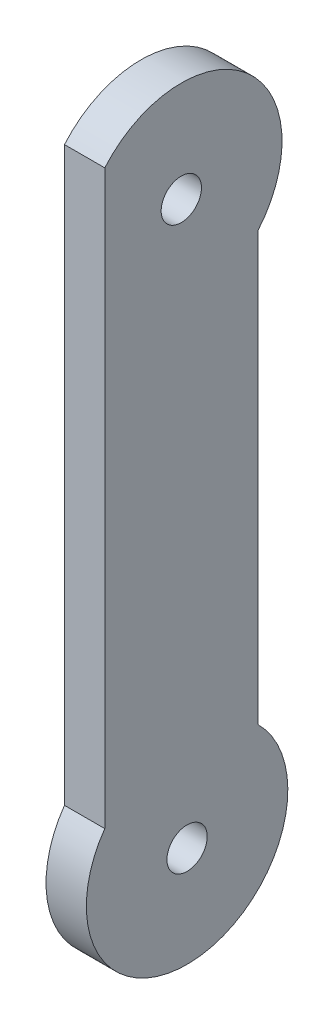
ISO-10303-21;
HEADER;
FILE_DESCRIPTION(('STEP AP214'),'2;1');
FILE_NAME('part.step','',(''),(''),'','','');
FILE_SCHEMA(('AUTOMOTIVE_DESIGN { 1 0 10303 214 1 1 1 1 }'));
ENDSEC;
DATA;
#1=APPLICATION_CONTEXT('core data for automotive mechanical design processes');
#2=APPLICATION_PROTOCOL_DEFINITION('international standard','automotive_design',2000,#1);
#3=PRODUCT_CONTEXT('',#1,'mechanical');
#4=PRODUCT('Part','Part','',(#3));
#5=PRODUCT_RELATED_PRODUCT_CATEGORY('part','',(#4));
#6=PRODUCT_DEFINITION_FORMATION('','',#4);
#7=PRODUCT_DEFINITION_CONTEXT('part definition',#1,'design');
#8=PRODUCT_DEFINITION('design','',#6,#7);
#9=PRODUCT_DEFINITION_SHAPE('','',#8);
#10=(LENGTH_UNIT() NAMED_UNIT(*) SI_UNIT(.MILLI.,.METRE.));
#11=(NAMED_UNIT(*) PLANE_ANGLE_UNIT() SI_UNIT($,.RADIAN.));
#12=(NAMED_UNIT(*) SI_UNIT($,.STERADIAN.) SOLID_ANGLE_UNIT());
#13=UNCERTAINTY_MEASURE_WITH_UNIT(LENGTH_MEASURE(1.E-05),#10,'distance_accuracy_value','');
#14=(GEOMETRIC_REPRESENTATION_CONTEXT(3) GLOBAL_UNCERTAINTY_ASSIGNED_CONTEXT((#13)) GLOBAL_UNIT_ASSIGNED_CONTEXT((#10,
#11,#12)) REPRESENTATION_CONTEXT('',''));
#15=CARTESIAN_POINT('',(0.,0.,0.));
#16=DIRECTION('',(0.,0.,1.));
#17=DIRECTION('',(1.,0.,0.));
#18=AXIS2_PLACEMENT_3D('',#15,#16,#17);
#19=CARTESIAN_POINT('',(10.,-77.074362047327,1.31056627289069));
#20=DIRECTION('',(-1.,0.,0.));
#21=DIRECTION('',(0.,0.,1.));
#22=AXIS2_PLACEMENT_3D('',#19,#20,#21);
#23=CYLINDRICAL_SURFACE('',#22,25.);
#24=CARTESIAN_POINT('',(0.,-77.074362047327,1.31056627289069));
#25=DIRECTION('',(1.,0.,0.));
#26=DIRECTION('',(0.,0.,-1.));
#27=AXIS2_PLACEMENT_3D('',#24,#25,#26);
#28=CIRCLE('',#27,25.);
#29=CARTESIAN_POINT('',(0.,-62.6652314422562,21.7403718325629));
#30=VERTEX_POINT('',#29);
#31=CARTESIAN_POINT('',(0.,-59.27332320586,-16.242866900269));
#32=VERTEX_POINT('',#31);
#33=EDGE_CURVE('E107',#30,#32,#28,.T.);
#34=ORIENTED_EDGE('',*,*,#33,.T.);
#35=DIRECTION('',(-1.,0.,0.));
#36=VECTOR('',#35,1.);
#37=CARTESIAN_POINT('',(10.,-59.27332320586,-16.242866900269));
#38=LINE('',#37,#36);
#39=CARTESIAN_POINT('',(10.,-59.27332320586,-16.242866900269));
#40=VERTEX_POINT('',#39);
#41=EDGE_CURVE('E11',#40,#32,#38,.T.);
#42=ORIENTED_EDGE('',*,*,#41,.F.);
#43=CARTESIAN_POINT('',(10.,-77.074362047327,1.31056627289069));
#44=DIRECTION('',(1.,0.,0.));
#45=DIRECTION('',(0.,0.,-1.));
#46=AXIS2_PLACEMENT_3D('',#43,#44,#45);
#47=CIRCLE('',#46,25.);
#48=CARTESIAN_POINT('',(10.,-62.6652314422562,21.7403718325629));
#49=VERTEX_POINT('',#48);
#50=EDGE_CURVE('E91',#49,#40,#47,.T.);
#51=ORIENTED_EDGE('',*,*,#50,.F.);
#52=DIRECTION('',(-1.,0.,0.));
#53=VECTOR('',#52,1.);
#54=CARTESIAN_POINT('',(10.,-62.6652314422562,21.7403718325629));
#55=LINE('',#54,#53);
#56=EDGE_CURVE('E103',#49,#30,#55,.T.);
#57=ORIENTED_EDGE('',*,*,#56,.T.);
#58=EDGE_LOOP('',(#34,#42,#51,#57));
#59=FACE_BOUND('',#58,.T.);
#60=ADVANCED_FACE('F39',(#59),#23,.T.);
#61=CARTESIAN_POINT('',(10.,46.8190250576375,-16.2428669002689));
#62=DIRECTION('',(0.,0.,1.));
#63=DIRECTION('',(0.,-1.,0.));
#64=AXIS2_PLACEMENT_3D('',#61,#62,#63);
#65=PLANE('',#64);
#66=DIRECTION('',(0.,1.,0.));
#67=VECTOR('',#66,1.);
#68=CARTESIAN_POINT('',(0.,46.8190250576375,-16.2428669002689));
#69=LINE('',#68,#67);
#70=CARTESIAN_POINT('',(0.,46.8190250576375,-16.2428669002689));
#71=VERTEX_POINT('',#70);
#72=EDGE_CURVE('E96',#32,#71,#69,.T.);
#73=ORIENTED_EDGE('',*,*,#72,.T.);
#74=DIRECTION('',(-1.,0.,0.));
#75=VECTOR('',#74,1.);
#76=CARTESIAN_POINT('',(10.,46.8190250576375,-16.2428669002689));
#77=LINE('',#76,#75);
#78=CARTESIAN_POINT('',(10.,46.8190250576375,-16.2428669002689));
#79=VERTEX_POINT('',#78);
#80=EDGE_CURVE('E48',#79,#71,#77,.T.);
#81=ORIENTED_EDGE('',*,*,#80,.F.);
#82=DIRECTION('',(0.,1.,0.));
#83=VECTOR('',#82,1.);
#84=CARTESIAN_POINT('',(10.,46.8190250576375,-16.2428669002689));
#85=LINE('',#84,#83);
#86=EDGE_CURVE('E86',#40,#79,#85,.T.);
#87=ORIENTED_EDGE('',*,*,#86,.F.);
#88=ORIENTED_EDGE('',*,*,#41,.T.);
#89=EDGE_LOOP('',(#73,#81,#87,#88));
#90=FACE_BOUND('',#89,.T.);
#91=ADVANCED_FACE('F95',(#90),#65,.F.);
#92=CARTESIAN_POINT('',(10.,63.0768968076906,2.74875246614697));
#93=DIRECTION('',(-1.,0.,0.));
#94=DIRECTION('',(0.,0.,1.));
#95=AXIS2_PLACEMENT_3D('',#92,#93,#94);
#96=CYLINDRICAL_SURFACE('',#95,25.);
#97=CARTESIAN_POINT('',(0.,63.0768968076906,2.74875246614697));
#98=DIRECTION('',(1.,0.,0.));
#99=DIRECTION('',(0.,0.,1.));
#100=AXIS2_PLACEMENT_3D('',#97,#98,#99);
#101=CIRCLE('',#100,25.);
#102=CARTESIAN_POINT('',(0.,79.3347685577438,21.7403718325629));
#103=VERTEX_POINT('',#102);
#104=EDGE_CURVE('E73',#71,#103,#101,.T.);
#105=ORIENTED_EDGE('',*,*,#104,.T.);
#106=DIRECTION('',(-1.,0.,0.));
#107=VECTOR('',#106,1.);
#108=CARTESIAN_POINT('',(10.,79.3347685577438,21.7403718325629));
#109=LINE('',#108,#107);
#110=CARTESIAN_POINT('',(10.,79.3347685577438,21.7403718325629));
#111=VERTEX_POINT('',#110);
#112=EDGE_CURVE('E98',#111,#103,#109,.T.);
#113=ORIENTED_EDGE('',*,*,#112,.F.);
#114=CARTESIAN_POINT('',(10.,63.0768968076906,2.74875246614697));
#115=DIRECTION('',(1.,0.,0.));
#116=DIRECTION('',(0.,0.,1.));
#117=AXIS2_PLACEMENT_3D('',#114,#115,#116);
#118=CIRCLE('',#117,25.);
#119=EDGE_CURVE('E89',#79,#111,#118,.T.);
#120=ORIENTED_EDGE('',*,*,#119,.F.);
#121=ORIENTED_EDGE('',*,*,#80,.T.);
#122=EDGE_LOOP('',(#105,#113,#120,#121));
#123=FACE_BOUND('',#122,.T.);
#124=ADVANCED_FACE('F99',(#123),#96,.T.);
#125=CARTESIAN_POINT('',(10.,79.3347685577438,21.7403718325629));
#126=DIRECTION('',(0.,0.,-1.));
#127=DIRECTION('',(0.,1.,0.));
#128=AXIS2_PLACEMENT_3D('',#125,#126,#127);
#129=PLANE('',#128);
#130=DIRECTION('',(0.,-1.,0.));
#131=VECTOR('',#130,1.);
#132=CARTESIAN_POINT('',(0.,79.3347685577438,21.7403718325629));
#133=LINE('',#132,#131);
#134=EDGE_CURVE('E79',#103,#30,#133,.T.);
#135=ORIENTED_EDGE('',*,*,#134,.T.);
#136=ORIENTED_EDGE('',*,*,#56,.F.);
#137=DIRECTION('',(0.,-1.,0.));
#138=VECTOR('',#137,1.);
#139=CARTESIAN_POINT('',(10.,79.3347685577438,21.7403718325629));
#140=LINE('',#139,#138);
#141=EDGE_CURVE('E56',#111,#49,#140,.T.);
#142=ORIENTED_EDGE('',*,*,#141,.F.);
#143=ORIENTED_EDGE('',*,*,#112,.T.);
#144=EDGE_LOOP('',(#135,#136,#142,#143));
#145=FACE_BOUND('',#144,.T.);
#146=ADVANCED_FACE('F121',(#145),#129,.F.);
#147=CARTESIAN_POINT('',(10.,-77.074362047327,1.31056627289069));
#148=DIRECTION('',(1.,0.,0.));
#149=DIRECTION('',(0.,0.,-1.));
#150=AXIS2_PLACEMENT_3D('',#147,#148,#149);
#151=PLANE('',#150);
#152=CARTESIAN_POINT('',(10.,63.0768968076906,2.74875246614697));
#153=DIRECTION('',(1.,0.,0.));
#154=DIRECTION('',(0.,0.,-1.));
#155=AXIS2_PLACEMENT_3D('',#152,#153,#154);
#156=CIRCLE('',#155,5.00000000000001);
#157=CARTESIAN_POINT('',(10.,63.0768968076906,-2.25124753385304));
#158=VERTEX_POINT('',#157);
#159=EDGE_CURVE('E136',#158,#158,#156,.T.);
#160=ORIENTED_EDGE('',*,*,#159,.F.);
#161=EDGE_LOOP('',(#160));
#162=FACE_BOUND('',#161,.T.);
#163=CARTESIAN_POINT('',(10.,-77.074362047327,1.31056627289069));
#164=DIRECTION('',(1.,0.,0.));
#165=DIRECTION('',(0.,0.,-1.));
#166=AXIS2_PLACEMENT_3D('',#163,#164,#165);
#167=CIRCLE('',#166,5.00000000000001);
#168=CARTESIAN_POINT('',(10.,-77.074362047327,-3.68943372710931));
#169=VERTEX_POINT('',#168);
#170=EDGE_CURVE('E128',#169,#169,#167,.T.);
#171=ORIENTED_EDGE('',*,*,#170,.F.);
#172=EDGE_LOOP('',(#171));
#173=FACE_BOUND('',#172,.T.);
#174=ORIENTED_EDGE('',*,*,#50,.T.);
#175=ORIENTED_EDGE('',*,*,#86,.T.);
#176=ORIENTED_EDGE('',*,*,#119,.T.);
#177=ORIENTED_EDGE('',*,*,#141,.T.);
#178=EDGE_LOOP('',(#174,#175,#176,#177));
#179=FACE_BOUND('',#178,.T.);
#180=ADVANCED_FACE('F87',(#162,#173,#179),#151,.T.);
#181=CARTESIAN_POINT('',(0.,-77.074362047327,1.31056627289069));
#182=DIRECTION('',(1.,0.,0.));
#183=DIRECTION('',(0.,0.,-1.));
#184=AXIS2_PLACEMENT_3D('',#181,#182,#183);
#185=PLANE('',#184);
#186=CARTESIAN_POINT('',(0.,63.0768968076906,2.74875246614697));
#187=DIRECTION('',(1.,0.,0.));
#188=DIRECTION('',(0.,0.,-1.));
#189=AXIS2_PLACEMENT_3D('',#186,#187,#188);
#190=CIRCLE('',#189,5.00000000000001);
#191=CARTESIAN_POINT('',(0.,63.0768968076906,-2.25124753385304));
#192=VERTEX_POINT('',#191);
#193=EDGE_CURVE('E111',#192,#192,#190,.T.);
#194=ORIENTED_EDGE('',*,*,#193,.T.);
#195=EDGE_LOOP('',(#194));
#196=FACE_BOUND('',#195,.T.);
#197=CARTESIAN_POINT('',(0.,-77.074362047327,1.31056627289069));
#198=DIRECTION('',(1.,0.,0.));
#199=DIRECTION('',(0.,0.,-1.));
#200=AXIS2_PLACEMENT_3D('',#197,#198,#199);
#201=CIRCLE('',#200,5.00000000000001);
#202=CARTESIAN_POINT('',(0.,-77.074362047327,-3.68943372710931));
#203=VERTEX_POINT('',#202);
#204=EDGE_CURVE('E132',#203,#203,#201,.T.);
#205=ORIENTED_EDGE('',*,*,#204,.T.);
#206=EDGE_LOOP('',(#205));
#207=FACE_BOUND('',#206,.T.);
#208=ORIENTED_EDGE('',*,*,#33,.F.);
#209=ORIENTED_EDGE('',*,*,#134,.F.);
#210=ORIENTED_EDGE('',*,*,#104,.F.);
#211=ORIENTED_EDGE('',*,*,#72,.F.);
#212=EDGE_LOOP('',(#208,#209,#210,#211));
#213=FACE_BOUND('',#212,.T.);
#214=ADVANCED_FACE('F124',(#196,#207,#213),#185,.F.);
#215=CARTESIAN_POINT('',(0.,-77.074362047327,1.31056627289069));
#216=DIRECTION('',(1.,0.,0.));
#217=DIRECTION('',(0.,0.,-1.));
#218=AXIS2_PLACEMENT_3D('',#215,#216,#217);
#219=CYLINDRICAL_SURFACE('',#218,5.00000000000001);
#220=ORIENTED_EDGE('',*,*,#204,.F.);
#221=EDGE_LOOP('',(#220));
#222=FACE_BOUND('',#221,.T.);
#223=ORIENTED_EDGE('',*,*,#170,.T.);
#224=EDGE_LOOP('',(#223));
#225=FACE_BOUND('',#224,.T.);
#226=ADVANCED_FACE('F149',(#222,#225),#219,.F.);
#227=CARTESIAN_POINT('',(0.,63.0768968076906,2.74875246614697));
#228=DIRECTION('',(1.,0.,0.));
#229=DIRECTION('',(0.,0.,-1.));
#230=AXIS2_PLACEMENT_3D('',#227,#228,#229);
#231=CYLINDRICAL_SURFACE('',#230,5.00000000000001);
#232=ORIENTED_EDGE('',*,*,#193,.F.);
#233=EDGE_LOOP('',(#232));
#234=FACE_BOUND('',#233,.T.);
#235=ORIENTED_EDGE('',*,*,#159,.T.);
#236=EDGE_LOOP('',(#235));
#237=FACE_BOUND('',#236,.T.);
#238=ADVANCED_FACE('F146',(#234,#237),#231,.F.);
#239=CLOSED_SHELL('',(#60,#91,#124,#146,#180,#214,#226,#238));
#240=MANIFOLD_SOLID_BREP('B2',#239);
#241=ADVANCED_BREP_SHAPE_REPRESENTATION('',(#18,#240),#14);
#242=SHAPE_DEFINITION_REPRESENTATION(#9,#241);
ENDSEC;
END-ISO-10303-21;
